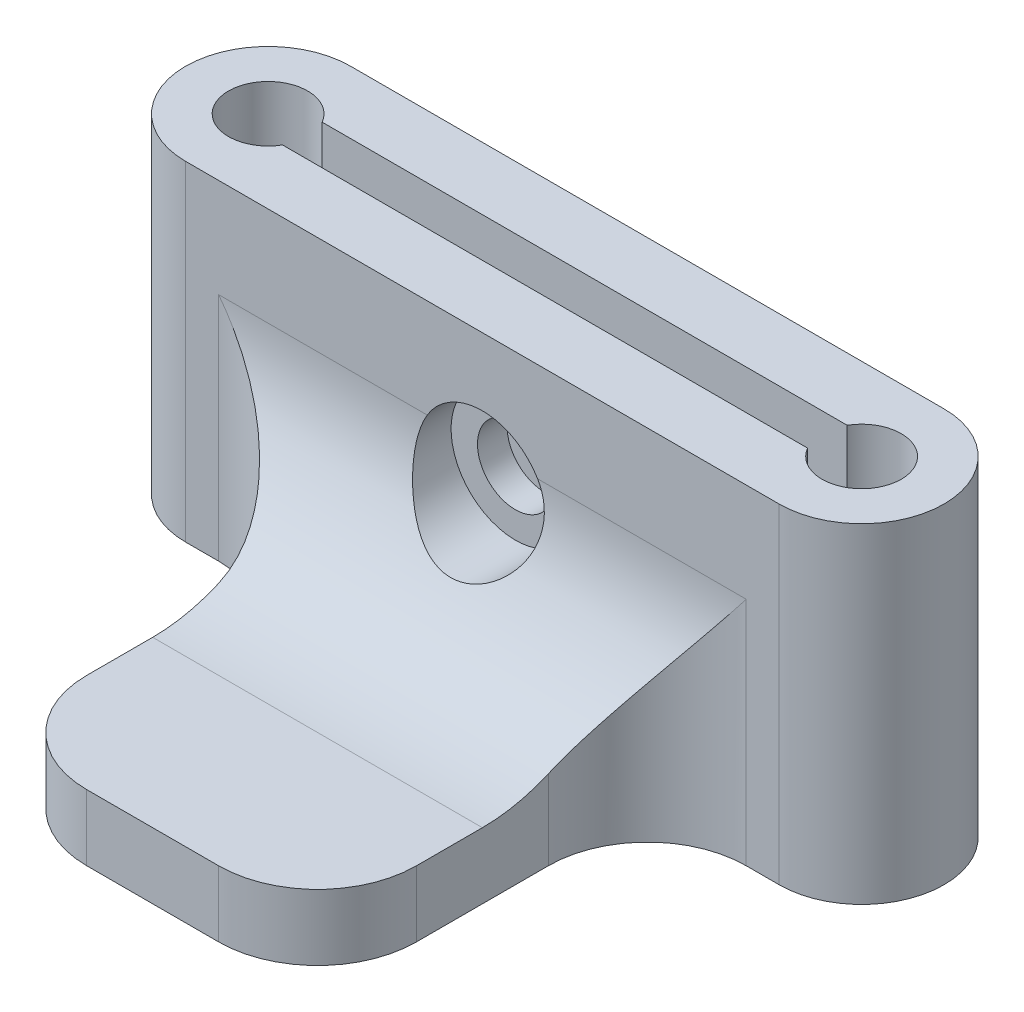
ISO-10303-21;
HEADER;
FILE_DESCRIPTION(('STEP AP214'),'2;1');
FILE_NAME('part.step','',(''),(''),'','','');
FILE_SCHEMA(('AUTOMOTIVE_DESIGN { 1 0 10303 214 1 1 1 1 }'));
ENDSEC;
DATA;
#1=APPLICATION_CONTEXT('core data for automotive mechanical design processes');
#2=APPLICATION_PROTOCOL_DEFINITION('international standard','automotive_design',2000,#1);
#3=PRODUCT_CONTEXT('',#1,'mechanical');
#4=PRODUCT('Part','Part','',(#3));
#5=PRODUCT_RELATED_PRODUCT_CATEGORY('part','',(#4));
#6=PRODUCT_DEFINITION_FORMATION('','',#4);
#7=PRODUCT_DEFINITION_CONTEXT('part definition',#1,'design');
#8=PRODUCT_DEFINITION('design','',#6,#7);
#9=PRODUCT_DEFINITION_SHAPE('','',#8);
#10=(LENGTH_UNIT() NAMED_UNIT(*) SI_UNIT(.MILLI.,.METRE.));
#11=(NAMED_UNIT(*) PLANE_ANGLE_UNIT() SI_UNIT($,.RADIAN.));
#12=(NAMED_UNIT(*) SI_UNIT($,.STERADIAN.) SOLID_ANGLE_UNIT());
#13=UNCERTAINTY_MEASURE_WITH_UNIT(LENGTH_MEASURE(1.E-05),#10,'distance_accuracy_value','');
#14=(GEOMETRIC_REPRESENTATION_CONTEXT(3) GLOBAL_UNCERTAINTY_ASSIGNED_CONTEXT((#13)) GLOBAL_UNIT_ASSIGNED_CONTEXT((#10,
#11,#12)) REPRESENTATION_CONTEXT('',''));
#15=CARTESIAN_POINT('',(0.,0.,0.));
#16=DIRECTION('',(0.,0.,1.));
#17=DIRECTION('',(1.,0.,0.));
#18=AXIS2_PLACEMENT_3D('',#15,#16,#17);
#19=CARTESIAN_POINT('',(0.,6.,-2.5));
#20=DIRECTION('',(0.,0.,1.));
#21=DIRECTION('',(1.,0.,0.));
#22=AXIS2_PLACEMENT_3D('',#19,#20,#21);
#23=CYLINDRICAL_SURFACE('',#22,1.15);
#24=CARTESIAN_POINT('',(0.,6.,-0.6));
#25=DIRECTION('',(0.,0.,-1.));
#26=DIRECTION('',(-1.,0.,0.));
#27=AXIS2_PLACEMENT_3D('',#24,#25,#26);
#28=CIRCLE('',#27,1.15);
#29=CARTESIAN_POINT('',(-1.15,6.,-0.6));
#30=VERTEX_POINT('',#29);
#31=EDGE_CURVE('E329',#30,#30,#28,.T.);
#32=ORIENTED_EDGE('',*,*,#31,.F.);
#33=EDGE_LOOP('',(#32));
#34=FACE_BOUND('',#33,.T.);
#35=CARTESIAN_POINT('',(0.,6.,-1.5));
#36=DIRECTION('',(0.,0.,-1.));
#37=DIRECTION('',(-1.,0.,0.));
#38=AXIS2_PLACEMENT_3D('',#35,#36,#37);
#39=CIRCLE('',#38,1.15);
#40=CARTESIAN_POINT('',(-1.15,6.,-1.5));
#41=VERTEX_POINT('',#40);
#42=EDGE_CURVE('E45',#41,#41,#39,.F.);
#43=ORIENTED_EDGE('',*,*,#42,.F.);
#44=EDGE_LOOP('',(#43));
#45=FACE_BOUND('',#44,.T.);
#46=ADVANCED_FACE('F40',(#34,#45),#23,.F.);
#47=CARTESIAN_POINT('',(0.,7.,7.5));
#48=DIRECTION('',(1.,0.,0.));
#49=DIRECTION('',(0.,0.,-1.));
#50=AXIS2_PLACEMENT_3D('',#47,#48,#49);
#51=CYLINDRICAL_SURFACE('',#50,5.);
#52=CARTESIAN_POINT('',(-1.67406690427832,7.,2.5));
#53=CARTESIAN_POINT('',(-1.70073308535738,6.95537167410613,2.49999521372656));
#54=CARTESIAN_POINT('',(-1.72560393459434,6.90966951600589,2.50059738903919));
#55=CARTESIAN_POINT('',(-1.77160805909839,6.81645570270009,2.50315368422021));
#56=CARTESIAN_POINT('',(-1.7927411796777,6.76894397270334,2.50510786002537));
#57=CARTESIAN_POINT('',(-1.83108568202305,6.6725409855971,2.51050127452824));
#58=CARTESIAN_POINT('',(-1.84830415099491,6.62365240453758,2.51393779631493));
#59=CARTESIAN_POINT('',(-1.87876602827185,6.52480215631494,2.52238465147333));
#60=CARTESIAN_POINT('',(-1.89200965863226,6.47484054926382,2.52739489689658));
#61=CARTESIAN_POINT('',(-1.92568587655717,6.32380490248232,2.54490318245181));
#62=CARTESIAN_POINT('',(-1.94006147560229,6.22158589355841,2.5598784679555));
#63=CARTESIAN_POINT('',(-1.95260783287905,6.01742386276196,2.59639696471644));
#64=CARTESIAN_POINT('',(-1.95078057769003,5.91548080858855,2.61793937048765));
#65=CARTESIAN_POINT('',(-1.93155792898881,5.71377902915791,2.66714469299253));
#66=CARTESIAN_POINT('',(-1.91404454984015,5.61404273859072,2.69485279681775));
#67=CARTESIAN_POINT('',(-1.86439505446577,5.41983399294414,2.75516747675803));
#68=CARTESIAN_POINT('',(-1.83225177503735,5.32536414192284,2.78777644722772));
#69=CARTESIAN_POINT('',(-1.75144744798655,5.13607670458817,2.85922079784568));
#70=CARTESIAN_POINT('',(-1.70165927186262,5.04185087596707,2.89834657650767));
#71=CARTESIAN_POINT('',(-1.58791427236824,4.86322527847743,2.97851806721827));
#72=CARTESIAN_POINT('',(-1.52394626205286,4.77883334855027,3.01956527486444));
#73=CARTESIAN_POINT('',(-1.37638650406848,4.61383635622896,3.10504308222561));
#74=CARTESIAN_POINT('',(-1.29150845583771,4.5343509785695,3.1494250327607));
#75=CARTESIAN_POINT('',(-1.10764526265568,4.39090326468846,3.23390765831196));
#76=CARTESIAN_POINT('',(-1.00867065171909,4.32692943268219,3.27401149146887));
#77=CARTESIAN_POINT('',(-0.819706330259922,4.22812959551905,3.33833165325809));
#78=CARTESIAN_POINT('',(-0.73196945786007,4.19002306987922,3.36412052998636));
#79=CARTESIAN_POINT('',(-0.550115255461745,4.12673666688064,3.40783109348003));
#80=CARTESIAN_POINT('',(-0.456005304824036,4.10154211902466,3.42576170537844));
#81=CARTESIAN_POINT('',(-0.263091665252293,4.06532603071649,3.45176496061463));
#82=CARTESIAN_POINT('',(-0.164262430572092,4.05439358680499,3.45977561755191));
#83=CARTESIAN_POINT('',(0.0341790008173856,4.04777646485801,3.46460664154788));
#84=CARTESIAN_POINT('',(0.133790991407256,4.05208789866325,3.46142986211588));
#85=CARTESIAN_POINT('',(0.3204216112927,4.07444030708378,3.44521880246339));
#86=CARTESIAN_POINT('',(0.407706405130025,4.09107111501183,3.43319779624441));
#87=CARTESIAN_POINT('',(0.577959542607837,4.13554013701498,3.40175582530999));
#88=CARTESIAN_POINT('',(0.660926403235689,4.16338217332143,3.3823323369958));
#89=CARTESIAN_POINT('',(0.826600776505699,4.23144109143092,3.33624266574503));
#90=CARTESIAN_POINT('',(0.90889545738563,4.27237923173694,3.30916923878892));
#91=CARTESIAN_POINT('',(1.06580552368436,4.36450375482435,3.25063076946663));
#92=CARTESIAN_POINT('',(1.14041693269123,4.41569540426173,3.21916347274062));
#93=CARTESIAN_POINT('',(1.29389878556669,4.53727871027522,3.14789608491217));
#94=CARTESIAN_POINT('',(1.37112607376683,4.60946749234836,3.10761462276115));
#95=CARTESIAN_POINT('',(1.51285896192311,4.76515056782671,3.02639180973856));
#96=CARTESIAN_POINT('',(1.5773547179897,4.84865352576855,2.98544997452374));
#97=CARTESIAN_POINT('',(1.69868503659308,5.03529007497091,2.90092350364397));
#98=CARTESIAN_POINT('',(1.75390999095337,5.1395718368558,2.85753962612015));
#99=CARTESIAN_POINT('',(1.84511422711802,5.35808842318574,2.77583791090763));
#100=CARTESIAN_POINT('',(1.88110121719857,5.47231923987139,2.737518048807));
#101=CARTESIAN_POINT('',(1.93053886984989,5.70219223062984,2.66995115518617));
#102=CARTESIAN_POINT('',(1.94495465107492,5.81752491230373,2.6403665337215));
#103=CARTESIAN_POINT('',(1.95282021644864,6.05075147763105,2.58948738352531));
#104=CARTESIAN_POINT('',(1.94627810393311,6.16864435388168,2.56818965425149));
#105=CARTESIAN_POINT('',(1.91343330832309,6.39061030171784,2.53613519536067));
#106=CARTESIAN_POINT('',(1.88919893197711,6.49487381241006,2.52452938213957));
#107=CARTESIAN_POINT('',(1.8237733720463,6.69837252566432,2.50806630861394));
#108=CARTESIAN_POINT('',(1.78261638637919,6.79761741843803,2.50319552399456));
#109=CARTESIAN_POINT('',(1.72429236613589,6.91090020437719,2.50076019776429));
#110=CARTESIAN_POINT('',(1.71463324580583,6.9289532450381,2.5004724635939));
#111=CARTESIAN_POINT('',(1.69476391910178,6.96472333204411,2.50009278544131));
#112=CARTESIAN_POINT('',(1.68455448377905,6.98244080379251,2.50000057446412));
#113=CARTESIAN_POINT('',(1.67406690427832,7.,2.5));
#114=B_SPLINE_CURVE_WITH_KNOTS('',3,(#52,#53,#54,#55,#56,#57,#58,#59,#60,#61,#62,#63,#64,#65,
#66,#67,#68,#69,#70,#71,#72,#73,#74,#75,#76,#77,#78,#79,#80,#81,#82,#83,#84,#85,#86,#87,#88,#89,
#90,#91,#92,#93,#94,#95,#96,#97,#98,#99,#100,#101,#102,#103,#104,#105,#106,#107,#108,#109,#110,
#111,#112,#113),.UNSPECIFIED.,.F.,.F.,(4,2,2,2,2,2,2,2,2,2,2,2,2,2,2,2,2,2,2,2,2,2,2,2,2,2,2,2,
2,2,4),(0.,0.155920196939484,0.311846845205551,0.467488910346208,0.623122278886434,
0.934407686939076,1.24565492982624,1.559263111899,1.87302501064688,2.21220387950027,
2.55165129633048,2.9233170109209,3.29470643204785,3.59072608719665,3.88640865708225,
4.18392967240916,4.48137480641129,4.74919574444659,5.01710806778148,5.30350477462581,
5.59004896648424,5.92807429817455,6.26635997258973,6.64164734353174,7.01678423124045,
7.37457510160791,7.73222764941226,8.05365969932871,8.37444535369733,8.4358712068405,
8.49721312628923),.UNSPECIFIED.);
#115=CARTESIAN_POINT('',(-1.67406690427832,7.,2.5));
#116=VERTEX_POINT('',#115);
#117=CARTESIAN_POINT('',(1.67406690427832,7.,2.5));
#118=VERTEX_POINT('',#117);
#119=EDGE_CURVE('E11',#116,#118,#114,.T.);
#120=ORIENTED_EDGE('',*,*,#119,.F.);
#121=DIRECTION('',(-1.,0.,0.));
#122=VECTOR('',#121,1.);
#123=CARTESIAN_POINT('',(8.,7.,2.5));
#124=LINE('',#123,#122);
#125=CARTESIAN_POINT('',(-8.,7.,2.5));
#126=VERTEX_POINT('',#125);
#127=EDGE_CURVE('E502',#126,#116,#124,.F.);
#128=ORIENTED_EDGE('',*,*,#127,.F.);
#129=CARTESIAN_POINT('',(-5.,2.41742430504416,5.5));
#130=CARTESIAN_POINT('',(-4.99999007584464,2.45619433572678,5.41111111999838));
#131=CARTESIAN_POINT('',(-5.00394885534584,2.49756553159917,5.32342396283325));
#132=CARTESIAN_POINT('',(-5.01909527387803,2.58497092461001,5.15122034191126));
#133=CARTESIAN_POINT('',(-5.0302710810227,2.63099738574335,5.06669892763461));
#134=CARTESIAN_POINT('',(-5.05900041117812,2.72681315065254,4.90214197951033));
#135=CARTESIAN_POINT('',(-5.07648778239047,2.77655933013036,4.82206950990215));
#136=CARTESIAN_POINT('',(-5.11717439439445,2.87977402986982,4.66583225064516));
#137=CARTESIAN_POINT('',(-5.14037657272063,2.93324445430396,4.58966949508105));
#138=CARTESIAN_POINT('',(-5.19855781113315,3.05784842466416,4.42217655542122));
#139=CARTESIAN_POINT('',(-5.23503000053933,3.12994713640746,4.33208183123255));
#140=CARTESIAN_POINT('',(-5.31482188342729,3.27855552023904,4.15875784631887));
#141=CARTESIAN_POINT('',(-5.3581465601076,3.35506837641435,4.07553364946838));
#142=CARTESIAN_POINT('',(-5.45077079658604,3.51210422984339,3.91570229294977));
#143=CARTESIAN_POINT('',(-5.50009596147952,3.59264348248161,3.83912606240481));
#144=CARTESIAN_POINT('',(-5.60362354169447,3.75677463200056,3.69295852675565));
#145=CARTESIAN_POINT('',(-5.65782452771141,3.84036563004705,3.62336518725023));
#146=CARTESIAN_POINT('',(-5.79274014298285,4.04392463557509,3.46462300080977));
#147=CARTESIAN_POINT('',(-5.87542029554436,4.16512727065971,3.37871762693228));
#148=CARTESIAN_POINT('',(-6.04705542389688,4.41143609639691,3.21971495392395));
#149=CARTESIAN_POINT('',(-6.13601288528328,4.53654382227045,3.14662276873676));
#150=CARTESIAN_POINT('',(-6.31881575359726,4.78979065819426,3.01274090730703));
#151=CARTESIAN_POINT('',(-6.41266284424725,4.91793080404366,2.95195550452723));
#152=CARTESIAN_POINT('',(-6.6040431359243,5.17643888357417,2.84228261146679));
#153=CARTESIAN_POINT('',(-6.70157575105506,5.30680646136508,2.79339323916331));
#154=CARTESIAN_POINT('',(-6.99243555246831,5.69263762108821,2.66650236970021));
#155=CARTESIAN_POINT('',(-7.18963215160217,5.9505018544787,2.60433245016192));
#156=CARTESIAN_POINT('',(-7.58839523182633,6.46860044004562,2.52142008987375));
#157=CARTESIAN_POINT('',(-7.7899519738823,6.72882888152428,2.50059336538387));
#158=CARTESIAN_POINT('',(-7.99422653603207,6.99254648939585,2.50000417362007));
#159=CARTESIAN_POINT('',(-7.99711328912772,6.99627327159147,2.50000000728194));
#160=CARTESIAN_POINT('',(-8.,7.,2.5));
#161=B_SPLINE_CURVE_WITH_KNOTS('',3,(#129,#130,#131,#132,#133,#134,#135,#136,#137,#138,#139,
#140,#141,#142,#143,#144,#145,#146,#147,#148,#149,#150,#151,#152,#153,#154,#155,#156,#157,#158,
#159,#160),.UNSPECIFIED.,.F.,.F.,(4,2,2,2,2,2,2,2,2,2,2,2,2,2,2,4),(0.,0.29071592607896,
0.580956446582332,0.868239309782245,1.15567015190112,1.5181890748171,1.88097284765794,
2.24536288350868,2.60964644752272,3.11894232553606,3.62844101097637,4.13811631474608,
4.64771093234505,5.63631090330857,6.6228934001838,6.63703554133181),.UNSPECIFIED.);
#162=CARTESIAN_POINT('',(-5.,2.41742430504416,5.5));
#163=VERTEX_POINT('',#162);
#164=EDGE_CURVE('E510',#163,#126,#161,.T.);
#165=ORIENTED_EDGE('',*,*,#164,.F.);
#166=CARTESIAN_POINT('',(-5.,7.,7.5));
#167=DIRECTION('',(-1.,0.,0.));
#168=DIRECTION('',(0.,0.,1.));
#169=AXIS2_PLACEMENT_3D('',#166,#167,#168);
#170=CIRCLE('',#169,5.);
#171=CARTESIAN_POINT('',(-5.,2.,7.5));
#172=VERTEX_POINT('',#171);
#173=EDGE_CURVE('E506',#172,#163,#170,.F.);
#174=ORIENTED_EDGE('',*,*,#173,.F.);
#175=DIRECTION('',(-1.,0.,0.));
#176=VECTOR('',#175,1.);
#177=CARTESIAN_POINT('',(-8.,2.,7.5));
#178=LINE('',#177,#176);
#179=CARTESIAN_POINT('',(5.,2.,7.5));
#180=VERTEX_POINT('',#179);
#181=EDGE_CURVE('E497',#180,#172,#178,.T.);
#182=ORIENTED_EDGE('',*,*,#181,.F.);
#183=CARTESIAN_POINT('',(5.,7.,7.5));
#184=DIRECTION('',(1.,0.,0.));
#185=DIRECTION('',(0.,0.,-1.));
#186=AXIS2_PLACEMENT_3D('',#183,#184,#185);
#187=CIRCLE('',#186,5.);
#188=CARTESIAN_POINT('',(5.,2.41742430504416,5.5));
#189=VERTEX_POINT('',#188);
#190=EDGE_CURVE('E51',#189,#180,#187,.F.);
#191=ORIENTED_EDGE('',*,*,#190,.F.);
#192=CARTESIAN_POINT('',(5.,2.41742430504416,5.5));
#193=CARTESIAN_POINT('',(4.99999007584464,2.45619433572678,5.41111111999838));
#194=CARTESIAN_POINT('',(5.00394885534584,2.49756553159917,5.32342396283325));
#195=CARTESIAN_POINT('',(5.01909527387803,2.58497092461001,5.15122034191126));
#196=CARTESIAN_POINT('',(5.0302710810227,2.63099738574335,5.06669892763461));
#197=CARTESIAN_POINT('',(5.05900041117813,2.72681315065254,4.90214197951033));
#198=CARTESIAN_POINT('',(5.07648778239047,2.77655933013036,4.82206950990215));
#199=CARTESIAN_POINT('',(5.11717439439445,2.87977402986982,4.66583225064516));
#200=CARTESIAN_POINT('',(5.14037657272063,2.93324445430396,4.58966949508105));
#201=CARTESIAN_POINT('',(5.19855781113315,3.05784842466416,4.42217655542122));
#202=CARTESIAN_POINT('',(5.23503000053933,3.12994713640746,4.33208183123255));
#203=CARTESIAN_POINT('',(5.3148218834273,3.27855552023904,4.15875784631887));
#204=CARTESIAN_POINT('',(5.35814656010761,3.35506837641435,4.07553364946838));
#205=CARTESIAN_POINT('',(5.45077079658604,3.51210422984339,3.91570229294977));
#206=CARTESIAN_POINT('',(5.50009596147952,3.59264348248161,3.83912606240481));
#207=CARTESIAN_POINT('',(5.60362354169447,3.75677463200056,3.69295852675565));
#208=CARTESIAN_POINT('',(5.65782452771141,3.84036563004705,3.62336518725023));
#209=CARTESIAN_POINT('',(5.79274014298285,4.04392463557509,3.46462300080977));
#210=CARTESIAN_POINT('',(5.87542029554436,4.16512727065971,3.37871762693228));
#211=CARTESIAN_POINT('',(6.04705542389688,4.41143609639691,3.21971495392395));
#212=CARTESIAN_POINT('',(6.13601288528329,4.53654382227045,3.14662276873676));
#213=CARTESIAN_POINT('',(6.31881575359726,4.78979065819426,3.01274090730703));
#214=CARTESIAN_POINT('',(6.41266284424726,4.91793080404366,2.95195550452723));
#215=CARTESIAN_POINT('',(6.6040431359243,5.17643888357417,2.84228261146679));
#216=CARTESIAN_POINT('',(6.70157575105506,5.30680646136508,2.79339323916331));
#217=CARTESIAN_POINT('',(6.99243555246832,5.69263762108821,2.66650236970021));
#218=CARTESIAN_POINT('',(7.18963215160217,5.9505018544787,2.60433245016192));
#219=CARTESIAN_POINT('',(7.58839523182633,6.46860044004562,2.52142008987375));
#220=CARTESIAN_POINT('',(7.7899519738823,6.72882888152428,2.50059336538387));
#221=CARTESIAN_POINT('',(7.99422653603207,6.99254648939585,2.50000417362007));
#222=CARTESIAN_POINT('',(7.99711328912772,6.99627327159147,2.50000000728194));
#223=CARTESIAN_POINT('',(8.,7.,2.5));
#224=B_SPLINE_CURVE_WITH_KNOTS('',3,(#192,#193,#194,#195,#196,#197,#198,#199,#200,#201,#202,
#203,#204,#205,#206,#207,#208,#209,#210,#211,#212,#213,#214,#215,#216,#217,#218,#219,#220,#221,
#222,#223),.UNSPECIFIED.,.F.,.F.,(4,2,2,2,2,2,2,2,2,2,2,2,2,2,2,4),(0.,0.29071592607896,
0.580956446582332,0.868239309782245,1.15567015190112,1.5181890748171,1.88097284765794,
2.24536288350868,2.60964644752272,3.11894232553606,3.62844101097637,4.13811631474608,
4.64771093234505,5.63631090330857,6.6228934001838,6.63703554133181),.UNSPECIFIED.);
#225=CARTESIAN_POINT('',(8.,7.,2.5));
#226=VERTEX_POINT('',#225);
#227=EDGE_CURVE('E518',#226,#189,#224,.F.);
#228=ORIENTED_EDGE('',*,*,#227,.F.);
#229=EDGE_CURVE('E501',#118,#226,#124,.F.);
#230=ORIENTED_EDGE('',*,*,#229,.F.);
#231=EDGE_LOOP('',(#120,#128,#165,#174,#182,#191,#228,#230));
#232=FACE_BOUND('',#231,.T.);
#233=ADVANCED_FACE('F42',(#232),#51,.F.);
#234=CARTESIAN_POINT('',(-9.,10.,0.));
#235=DIRECTION('',(0.,1.,0.));
#236=DIRECTION('',(0.,0.,1.));
#237=AXIS2_PLACEMENT_3D('',#234,#235,#236);
#238=PLANE('',#237);
#239=DIRECTION('',(1.,0.,0.));
#240=VECTOR('',#239,1.);
#241=CARTESIAN_POINT('',(-7.96076951545867,10.,-0.6));
#242=LINE('',#241,#240);
#243=CARTESIAN_POINT('',(-7.96076951545867,10.,-0.599999999999996));
#244=VERTEX_POINT('',#243);
#245=CARTESIAN_POINT('',(7.96076951545867,10.,-0.6));
#246=VERTEX_POINT('',#245);
#247=EDGE_CURVE('E345',#244,#246,#242,.T.);
#248=ORIENTED_EDGE('',*,*,#247,.T.);
#249=CARTESIAN_POINT('',(9.,10.,0.));
#250=DIRECTION('',(0.,1.,0.));
#251=DIRECTION('',(0.,0.,1.));
#252=AXIS2_PLACEMENT_3D('',#249,#250,#251);
#253=CIRCLE('',#252,1.2);
#254=CARTESIAN_POINT('',(7.96076951545867,10.,0.6));
#255=VERTEX_POINT('',#254);
#256=EDGE_CURVE('E400',#255,#246,#253,.T.);
#257=ORIENTED_EDGE('',*,*,#256,.F.);
#258=DIRECTION('',(-1.,0.,0.));
#259=VECTOR('',#258,1.);
#260=CARTESIAN_POINT('',(-7.96076951545867,10.,0.6));
#261=LINE('',#260,#259);
#262=CARTESIAN_POINT('',(-7.96076951545867,10.,0.6));
#263=VERTEX_POINT('',#262);
#264=EDGE_CURVE('E341',#255,#263,#261,.T.);
#265=ORIENTED_EDGE('',*,*,#264,.T.);
#266=CARTESIAN_POINT('',(-9.,10.,0.));
#267=DIRECTION('',(0.,1.,0.));
#268=DIRECTION('',(0.,0.,-1.));
#269=AXIS2_PLACEMENT_3D('',#266,#267,#268);
#270=CIRCLE('',#269,1.2);
#271=EDGE_CURVE('E392',#244,#263,#270,.T.);
#272=ORIENTED_EDGE('',*,*,#271,.F.);
#273=EDGE_LOOP('',(#248,#257,#265,#272));
#274=FACE_BOUND('',#273,.T.);
#275=CARTESIAN_POINT('',(-9.,10.,0.));
#276=DIRECTION('',(0.,1.,0.));
#277=DIRECTION('',(0.,0.,1.));
#278=AXIS2_PLACEMENT_3D('',#275,#276,#277);
#279=CIRCLE('',#278,2.5);
#280=CARTESIAN_POINT('',(-9.,10.,-2.5));
#281=VERTEX_POINT('',#280);
#282=CARTESIAN_POINT('',(-9.,10.,2.5));
#283=VERTEX_POINT('',#282);
#284=EDGE_CURVE('E408',#281,#283,#279,.T.);
#285=ORIENTED_EDGE('',*,*,#284,.T.);
#286=DIRECTION('',(1.,0.,0.));
#287=VECTOR('',#286,1.);
#288=CARTESIAN_POINT('',(-9.,10.,2.5));
#289=LINE('',#288,#287);
#290=CARTESIAN_POINT('',(9.,10.,2.5));
#291=VERTEX_POINT('',#290);
#292=EDGE_CURVE('E412',#283,#291,#289,.T.);
#293=ORIENTED_EDGE('',*,*,#292,.T.);
#294=CARTESIAN_POINT('',(9.,10.,0.));
#295=DIRECTION('',(0.,1.,0.));
#296=DIRECTION('',(0.,0.,1.));
#297=AXIS2_PLACEMENT_3D('',#294,#295,#296);
#298=CIRCLE('',#297,2.5);
#299=CARTESIAN_POINT('',(9.,10.,-2.5));
#300=VERTEX_POINT('',#299);
#301=EDGE_CURVE('E416',#291,#300,#298,.T.);
#302=ORIENTED_EDGE('',*,*,#301,.T.);
#303=DIRECTION('',(-1.,0.,0.));
#304=VECTOR('',#303,1.);
#305=CARTESIAN_POINT('',(-9.,10.,-2.5));
#306=LINE('',#305,#304);
#307=EDGE_CURVE('E419',#300,#281,#306,.T.);
#308=ORIENTED_EDGE('',*,*,#307,.T.);
#309=EDGE_LOOP('',(#285,#293,#302,#308));
#310=FACE_BOUND('',#309,.T.);
#311=ADVANCED_FACE('F564',(#274,#310),#238,.T.);
#312=CARTESIAN_POINT('',(-9.,0.,0.));
#313=DIRECTION('',(0.,1.,0.));
#314=DIRECTION('',(0.,0.,1.));
#315=AXIS2_PLACEMENT_3D('',#312,#313,#314);
#316=PLANE('',#315);
#317=DIRECTION('',(-1.,0.,0.));
#318=VECTOR('',#317,1.);
#319=CARTESIAN_POINT('',(-5.,0.,12.5));
#320=LINE('',#319,#318);
#321=CARTESIAN_POINT('',(2.,0.,12.5));
#322=VERTEX_POINT('',#321);
#323=CARTESIAN_POINT('',(-2.,0.,12.5));
#324=VERTEX_POINT('',#323);
#325=EDGE_CURVE('E385',#322,#324,#320,.T.);
#326=ORIENTED_EDGE('',*,*,#325,.T.);
#327=CARTESIAN_POINT('',(-2.,0.,9.5));
#328=DIRECTION('',(0.,1.,0.));
#329=DIRECTION('',(0.,0.,1.));
#330=AXIS2_PLACEMENT_3D('',#327,#328,#329);
#331=CIRCLE('',#330,3.);
#332=CARTESIAN_POINT('',(-5.,0.,9.5));
#333=VERTEX_POINT('',#332);
#334=EDGE_CURVE('E461',#324,#333,#331,.F.);
#335=ORIENTED_EDGE('',*,*,#334,.T.);
#336=DIRECTION('',(0.,0.,-1.));
#337=VECTOR('',#336,1.);
#338=CARTESIAN_POINT('',(-5.,0.,12.5));
#339=LINE('',#338,#337);
#340=CARTESIAN_POINT('',(-5.,0.,5.5));
#341=VERTEX_POINT('',#340);
#342=EDGE_CURVE('E373',#333,#341,#339,.T.);
#343=ORIENTED_EDGE('',*,*,#342,.T.);
#344=CARTESIAN_POINT('',(-8.,0.,5.5));
#345=DIRECTION('',(0.,1.,0.));
#346=DIRECTION('',(0.,0.,1.));
#347=AXIS2_PLACEMENT_3D('',#344,#345,#346);
#348=CIRCLE('',#347,3.);
#349=CARTESIAN_POINT('',(-8.,0.,2.5));
#350=VERTEX_POINT('',#349);
#351=EDGE_CURVE('E494',#341,#350,#348,.T.);
#352=ORIENTED_EDGE('',*,*,#351,.T.);
#353=DIRECTION('',(1.,0.,0.));
#354=VECTOR('',#353,1.);
#355=CARTESIAN_POINT('',(-9.,0.,2.5));
#356=LINE('',#355,#354);
#357=CARTESIAN_POINT('',(-9.,0.,2.5));
#358=VERTEX_POINT('',#357);
#359=EDGE_CURVE('E427',#358,#350,#356,.T.);
#360=ORIENTED_EDGE('',*,*,#359,.F.);
#361=CARTESIAN_POINT('',(-9.,0.,0.));
#362=DIRECTION('',(0.,1.,0.));
#363=DIRECTION('',(0.,0.,1.));
#364=AXIS2_PLACEMENT_3D('',#361,#362,#363);
#365=CIRCLE('',#364,2.5);
#366=CARTESIAN_POINT('',(-9.,0.,-2.5));
#367=VERTEX_POINT('',#366);
#368=EDGE_CURVE('E404',#367,#358,#365,.T.);
#369=ORIENTED_EDGE('',*,*,#368,.F.);
#370=DIRECTION('',(-1.,0.,0.));
#371=VECTOR('',#370,1.);
#372=CARTESIAN_POINT('',(-9.,0.,-2.5));
#373=LINE('',#372,#371);
#374=CARTESIAN_POINT('',(9.,0.,-2.5));
#375=VERTEX_POINT('',#374);
#376=EDGE_CURVE('E413',#375,#367,#373,.T.);
#377=ORIENTED_EDGE('',*,*,#376,.F.);
#378=CARTESIAN_POINT('',(9.,0.,0.));
#379=DIRECTION('',(0.,1.,0.));
#380=DIRECTION('',(0.,0.,1.));
#381=AXIS2_PLACEMENT_3D('',#378,#379,#380);
#382=CIRCLE('',#381,2.5);
#383=CARTESIAN_POINT('',(9.,0.,2.5));
#384=VERTEX_POINT('',#383);
#385=EDGE_CURVE('E431',#384,#375,#382,.T.);
#386=ORIENTED_EDGE('',*,*,#385,.F.);
#387=CARTESIAN_POINT('',(8.,0.,2.5));
#388=VERTEX_POINT('',#387);
#389=EDGE_CURVE('E426',#388,#384,#356,.T.);
#390=ORIENTED_EDGE('',*,*,#389,.F.);
#391=CARTESIAN_POINT('',(8.,0.,5.5));
#392=DIRECTION('',(0.,1.,0.));
#393=DIRECTION('',(0.,0.,1.));
#394=AXIS2_PLACEMENT_3D('',#391,#392,#393);
#395=CIRCLE('',#394,3.);
#396=CARTESIAN_POINT('',(5.,0.,5.5));
#397=VERTEX_POINT('',#396);
#398=EDGE_CURVE('E491',#388,#397,#395,.T.);
#399=ORIENTED_EDGE('',*,*,#398,.T.);
#400=DIRECTION('',(0.,0.,1.));
#401=VECTOR('',#400,1.);
#402=CARTESIAN_POINT('',(5.,0.,12.5));
#403=LINE('',#402,#401);
#404=CARTESIAN_POINT('',(5.,0.,9.5));
#405=VERTEX_POINT('',#404);
#406=EDGE_CURVE('E359',#397,#405,#403,.T.);
#407=ORIENTED_EDGE('',*,*,#406,.T.);
#408=CARTESIAN_POINT('',(2.,0.,9.5));
#409=DIRECTION('',(0.,1.,0.));
#410=DIRECTION('',(0.,0.,1.));
#411=AXIS2_PLACEMENT_3D('',#408,#409,#410);
#412=CIRCLE('',#411,3.);
#413=EDGE_CURVE('E458',#405,#322,#412,.F.);
#414=ORIENTED_EDGE('',*,*,#413,.T.);
#415=EDGE_LOOP('',(#326,#335,#343,#352,#360,#369,#377,#386,#390,#399,#407,#414));
#416=FACE_BOUND('',#415,.T.);
#417=CARTESIAN_POINT('',(9.,0.,0.));
#418=DIRECTION('',(0.,1.,0.));
#419=DIRECTION('',(0.,0.,1.));
#420=AXIS2_PLACEMENT_3D('',#417,#418,#419);
#421=CIRCLE('',#420,1.2);
#422=CARTESIAN_POINT('',(7.96076951545867,0.,0.6));
#423=VERTEX_POINT('',#422);
#424=CARTESIAN_POINT('',(7.96076951545867,0.,-0.6));
#425=VERTEX_POINT('',#424);
#426=EDGE_CURVE('E396',#423,#425,#421,.T.);
#427=ORIENTED_EDGE('',*,*,#426,.T.);
#428=DIRECTION('',(1.,0.,0.));
#429=VECTOR('',#428,1.);
#430=CARTESIAN_POINT('',(-7.96076951545867,0.,-0.6));
#431=LINE('',#430,#429);
#432=CARTESIAN_POINT('',(-7.96076951545867,0.,-0.6));
#433=VERTEX_POINT('',#432);
#434=EDGE_CURVE('E346',#433,#425,#431,.T.);
#435=ORIENTED_EDGE('',*,*,#434,.F.);
#436=CARTESIAN_POINT('',(-9.,0.,0.));
#437=DIRECTION('',(0.,1.,0.));
#438=DIRECTION('',(0.,0.,-1.));
#439=AXIS2_PLACEMENT_3D('',#436,#437,#438);
#440=CIRCLE('',#439,1.2);
#441=CARTESIAN_POINT('',(-7.96076951545867,0.,0.599999999999996));
#442=VERTEX_POINT('',#441);
#443=EDGE_CURVE('E381',#433,#442,#440,.T.);
#444=ORIENTED_EDGE('',*,*,#443,.T.);
#445=DIRECTION('',(-1.,0.,0.));
#446=VECTOR('',#445,1.);
#447=CARTESIAN_POINT('',(-7.96076951545867,0.,0.6));
#448=LINE('',#447,#446);
#449=EDGE_CURVE('E340',#423,#442,#448,.T.);
#450=ORIENTED_EDGE('',*,*,#449,.F.);
#451=EDGE_LOOP('',(#427,#435,#444,#450));
#452=FACE_BOUND('',#451,.T.);
#453=ADVANCED_FACE('F548',(#416,#452),#316,.F.);
#454=CARTESIAN_POINT('',(-9.,10.,0.));
#455=DIRECTION('',(0.,-1.,0.));
#456=DIRECTION('',(0.,0.,-1.));
#457=AXIS2_PLACEMENT_3D('',#454,#455,#456);
#458=CYLINDRICAL_SURFACE('',#457,2.5);
#459=ORIENTED_EDGE('',*,*,#368,.T.);
#460=DIRECTION('',(0.,-1.,0.));
#461=VECTOR('',#460,1.);
#462=CARTESIAN_POINT('',(-9.,10.,2.5));
#463=LINE('',#462,#461);
#464=EDGE_CURVE('E447',#283,#358,#463,.T.);
#465=ORIENTED_EDGE('',*,*,#464,.F.);
#466=ORIENTED_EDGE('',*,*,#284,.F.);
#467=DIRECTION('',(0.,-1.,0.));
#468=VECTOR('',#467,1.);
#469=CARTESIAN_POINT('',(-9.,10.,-2.5));
#470=LINE('',#469,#468);
#471=EDGE_CURVE('E422',#281,#367,#470,.T.);
#472=ORIENTED_EDGE('',*,*,#471,.T.);
#473=EDGE_LOOP('',(#459,#465,#466,#472));
#474=FACE_BOUND('',#473,.T.);
#475=ADVANCED_FACE('F544',(#474),#458,.T.);
#476=CARTESIAN_POINT('',(-9.,10.,2.5));
#477=DIRECTION('',(0.,0.,-1.));
#478=DIRECTION('',(-1.,0.,0.));
#479=AXIS2_PLACEMENT_3D('',#476,#477,#478);
#480=PLANE('',#479);
#481=CARTESIAN_POINT('',(0.,6.,2.5));
#482=DIRECTION('',(0.,0.,-1.));
#483=DIRECTION('',(-1.,0.,0.));
#484=AXIS2_PLACEMENT_3D('',#481,#482,#483);
#485=CIRCLE('',#484,1.95);
#486=EDGE_CURVE('E71',#118,#116,#485,.F.);
#487=ORIENTED_EDGE('',*,*,#486,.F.);
#488=ORIENTED_EDGE('',*,*,#229,.T.);
#489=DIRECTION('',(0.,-1.,0.));
#490=VECTOR('',#489,1.);
#491=CARTESIAN_POINT('',(8.,10.,2.5));
#492=LINE('',#491,#490);
#493=EDGE_CURVE('E487',#226,#388,#492,.T.);
#494=ORIENTED_EDGE('',*,*,#493,.T.);
#495=ORIENTED_EDGE('',*,*,#389,.T.);
#496=DIRECTION('',(0.,-1.,0.));
#497=VECTOR('',#496,1.);
#498=CARTESIAN_POINT('',(9.,10.,2.5));
#499=LINE('',#498,#497);
#500=EDGE_CURVE('E443',#291,#384,#499,.T.);
#501=ORIENTED_EDGE('',*,*,#500,.F.);
#502=ORIENTED_EDGE('',*,*,#292,.F.);
#503=ORIENTED_EDGE('',*,*,#464,.T.);
#504=ORIENTED_EDGE('',*,*,#359,.T.);
#505=DIRECTION('',(0.,1.,0.));
#506=VECTOR('',#505,1.);
#507=CARTESIAN_POINT('',(-8.,10.,2.5));
#508=LINE('',#507,#506);
#509=EDGE_CURVE('E484',#350,#126,#508,.T.);
#510=ORIENTED_EDGE('',*,*,#509,.T.);
#511=ORIENTED_EDGE('',*,*,#127,.T.);
#512=EDGE_LOOP('',(#487,#488,#494,#495,#501,#502,#503,#504,#510,#511));
#513=FACE_BOUND('',#512,.T.);
#514=ADVANCED_FACE('F547',(#513),#480,.F.);
#515=CARTESIAN_POINT('',(9.,10.,0.));
#516=DIRECTION('',(0.,-1.,0.));
#517=DIRECTION('',(0.,0.,-1.));
#518=AXIS2_PLACEMENT_3D('',#515,#516,#517);
#519=CYLINDRICAL_SURFACE('',#518,2.5);
#520=ORIENTED_EDGE('',*,*,#385,.T.);
#521=DIRECTION('',(0.,-1.,0.));
#522=VECTOR('',#521,1.);
#523=CARTESIAN_POINT('',(9.,10.,-2.5));
#524=LINE('',#523,#522);
#525=EDGE_CURVE('E439',#300,#375,#524,.T.);
#526=ORIENTED_EDGE('',*,*,#525,.F.);
#527=ORIENTED_EDGE('',*,*,#301,.F.);
#528=ORIENTED_EDGE('',*,*,#500,.T.);
#529=EDGE_LOOP('',(#520,#526,#527,#528));
#530=FACE_BOUND('',#529,.T.);
#531=ADVANCED_FACE('F552',(#530),#519,.T.);
#532=CARTESIAN_POINT('',(-9.,10.,-2.5));
#533=DIRECTION('',(0.,0.,1.));
#534=DIRECTION('',(1.,0.,0.));
#535=AXIS2_PLACEMENT_3D('',#532,#533,#534);
#536=PLANE('',#535);
#537=DIRECTION('',(0.866025403784438,-0.5,0.));
#538=VECTOR('',#537,1.);
#539=CARTESIAN_POINT('',(0.,8.42487113059643,-2.5));
#540=LINE('',#539,#538);
#541=CARTESIAN_POINT('',(0.,8.42487113059643,-2.5));
#542=VERTEX_POINT('',#541);
#543=CARTESIAN_POINT('',(2.1,7.21243556529821,-2.5));
#544=VERTEX_POINT('',#543);
#545=EDGE_CURVE('E299',#542,#544,#540,.T.);
#546=ORIENTED_EDGE('',*,*,#545,.F.);
#547=DIRECTION('',(0.866025403784439,0.499999999999999,0.));
#548=VECTOR('',#547,1.);
#549=CARTESIAN_POINT('',(-2.1,7.21243556529822,-2.5));
#550=LINE('',#549,#548);
#551=CARTESIAN_POINT('',(-2.1,7.21243556529822,-2.5));
#552=VERTEX_POINT('',#551);
#553=EDGE_CURVE('E62',#552,#542,#550,.T.);
#554=ORIENTED_EDGE('',*,*,#553,.F.);
#555=DIRECTION('',(0.,1.,0.));
#556=VECTOR('',#555,1.);
#557=CARTESIAN_POINT('',(-2.1,4.78756443470179,-2.5));
#558=LINE('',#557,#556);
#559=CARTESIAN_POINT('',(-2.1,4.78756443470179,-2.5));
#560=VERTEX_POINT('',#559);
#561=EDGE_CURVE('E277',#560,#552,#558,.T.);
#562=ORIENTED_EDGE('',*,*,#561,.F.);
#563=DIRECTION('',(-0.866025403784438,0.5,0.));
#564=VECTOR('',#563,1.);
#565=CARTESIAN_POINT('',(0.,3.57512886940357,-2.5));
#566=LINE('',#565,#564);
#567=CARTESIAN_POINT('',(0.,3.57512886940357,-2.5));
#568=VERTEX_POINT('',#567);
#569=EDGE_CURVE('E283',#568,#560,#566,.T.);
#570=ORIENTED_EDGE('',*,*,#569,.F.);
#571=DIRECTION('',(-0.866025403784439,-0.499999999999999,0.));
#572=VECTOR('',#571,1.);
#573=CARTESIAN_POINT('',(2.1,4.78756443470178,-2.5));
#574=LINE('',#573,#572);
#575=CARTESIAN_POINT('',(2.1,4.78756443470178,-2.5));
#576=VERTEX_POINT('',#575);
#577=EDGE_CURVE('E306',#576,#568,#574,.T.);
#578=ORIENTED_EDGE('',*,*,#577,.F.);
#579=DIRECTION('',(0.,-1.,0.));
#580=VECTOR('',#579,1.);
#581=CARTESIAN_POINT('',(2.1,7.21243556529821,-2.5));
#582=LINE('',#581,#580);
#583=EDGE_CURVE('E302',#544,#576,#582,.T.);
#584=ORIENTED_EDGE('',*,*,#583,.F.);
#585=EDGE_LOOP('',(#546,#554,#562,#570,#578,#584));
#586=FACE_BOUND('',#585,.T.);
#587=ORIENTED_EDGE('',*,*,#376,.T.);
#588=ORIENTED_EDGE('',*,*,#471,.F.);
#589=ORIENTED_EDGE('',*,*,#307,.F.);
#590=ORIENTED_EDGE('',*,*,#525,.T.);
#591=EDGE_LOOP('',(#587,#588,#589,#590));
#592=FACE_BOUND('',#591,.T.);
#593=ADVANCED_FACE('F556',(#586,#592),#536,.F.);
#594=CARTESIAN_POINT('',(9.,10.,0.));
#595=DIRECTION('',(0.,-1.,0.));
#596=DIRECTION('',(0.,0.,-1.));
#597=AXIS2_PLACEMENT_3D('',#594,#595,#596);
#598=CYLINDRICAL_SURFACE('',#597,1.2);
#599=DIRECTION('',(0.,-1.,0.));
#600=VECTOR('',#599,1.);
#601=CARTESIAN_POINT('',(7.96076951545867,10.,-0.6));
#602=LINE('',#601,#600);
#603=EDGE_CURVE('E355',#246,#425,#602,.T.);
#604=ORIENTED_EDGE('',*,*,#603,.T.);
#605=ORIENTED_EDGE('',*,*,#426,.F.);
#606=DIRECTION('',(0.,-1.,0.));
#607=VECTOR('',#606,1.);
#608=CARTESIAN_POINT('',(7.96076951545867,10.,0.6));
#609=LINE('',#608,#607);
#610=EDGE_CURVE('E350',#255,#423,#609,.T.);
#611=ORIENTED_EDGE('',*,*,#610,.F.);
#612=ORIENTED_EDGE('',*,*,#256,.T.);
#613=EDGE_LOOP('',(#604,#605,#611,#612));
#614=FACE_BOUND('',#613,.T.);
#615=ADVANCED_FACE('F560',(#614),#598,.F.);
#616=CARTESIAN_POINT('',(-9.,10.,0.));
#617=DIRECTION('',(0.,-1.,0.));
#618=DIRECTION('',(0.,0.,-1.));
#619=AXIS2_PLACEMENT_3D('',#616,#617,#618);
#620=CYLINDRICAL_SURFACE('',#619,1.2);
#621=DIRECTION('',(0.,-1.,0.));
#622=VECTOR('',#621,1.);
#623=CARTESIAN_POINT('',(-7.96076951545867,10.,-0.6));
#624=LINE('',#623,#622);
#625=EDGE_CURVE('E360',#244,#433,#624,.T.);
#626=ORIENTED_EDGE('',*,*,#625,.F.);
#627=ORIENTED_EDGE('',*,*,#271,.T.);
#628=DIRECTION('',(0.,-1.,0.));
#629=VECTOR('',#628,1.);
#630=CARTESIAN_POINT('',(-7.96076951545867,10.,0.6));
#631=LINE('',#630,#629);
#632=EDGE_CURVE('E363',#263,#442,#631,.T.);
#633=ORIENTED_EDGE('',*,*,#632,.T.);
#634=ORIENTED_EDGE('',*,*,#443,.F.);
#635=EDGE_LOOP('',(#626,#627,#633,#634));
#636=FACE_BOUND('',#635,.T.);
#637=ADVANCED_FACE('F571',(#636),#620,.F.);
#638=CARTESIAN_POINT('',(5.,2.,12.5));
#639=DIRECTION('',(1.,0.,0.));
#640=DIRECTION('',(0.,0.,-1.));
#641=AXIS2_PLACEMENT_3D('',#638,#639,#640);
#642=PLANE('',#641);
#643=DIRECTION('',(0.,-1.,0.));
#644=VECTOR('',#643,1.);
#645=CARTESIAN_POINT('',(5.,2.,5.5));
#646=LINE('',#645,#644);
#647=EDGE_CURVE('E477',#397,#189,#646,.F.);
#648=ORIENTED_EDGE('',*,*,#647,.T.);
#649=ORIENTED_EDGE('',*,*,#190,.T.);
#650=DIRECTION('',(0.,0.,1.));
#651=VECTOR('',#650,1.);
#652=CARTESIAN_POINT('',(5.,2.,12.5));
#653=LINE('',#652,#651);
#654=CARTESIAN_POINT('',(5.,2.,9.5));
#655=VERTEX_POINT('',#654);
#656=EDGE_CURVE('E369',#180,#655,#653,.T.);
#657=ORIENTED_EDGE('',*,*,#656,.T.);
#658=DIRECTION('',(0.,-1.,0.));
#659=VECTOR('',#658,1.);
#660=CARTESIAN_POINT('',(5.,2.,9.5));
#661=LINE('',#660,#659);
#662=EDGE_CURVE('E480',#655,#405,#661,.T.);
#663=ORIENTED_EDGE('',*,*,#662,.T.);
#664=ORIENTED_EDGE('',*,*,#406,.F.);
#665=EDGE_LOOP('',(#648,#649,#657,#663,#664));
#666=FACE_BOUND('',#665,.T.);
#667=ADVANCED_FACE('F575',(#666),#642,.T.);
#668=CARTESIAN_POINT('',(-5.,2.,12.5));
#669=DIRECTION('',(-1.,0.,0.));
#670=DIRECTION('',(0.,0.,1.));
#671=AXIS2_PLACEMENT_3D('',#668,#669,#670);
#672=PLANE('',#671);
#673=ORIENTED_EDGE('',*,*,#342,.F.);
#674=DIRECTION('',(0.,-1.,0.));
#675=VECTOR('',#674,1.);
#676=CARTESIAN_POINT('',(-5.,2.,9.5));
#677=LINE('',#676,#675);
#678=CARTESIAN_POINT('',(-5.,2.,9.5));
#679=VERTEX_POINT('',#678);
#680=EDGE_CURVE('E467',#333,#679,#677,.F.);
#681=ORIENTED_EDGE('',*,*,#680,.T.);
#682=DIRECTION('',(0.,0.,-1.));
#683=VECTOR('',#682,1.);
#684=CARTESIAN_POINT('',(-5.,2.,12.5));
#685=LINE('',#684,#683);
#686=EDGE_CURVE('E377',#679,#172,#685,.T.);
#687=ORIENTED_EDGE('',*,*,#686,.T.);
#688=ORIENTED_EDGE('',*,*,#173,.T.);
#689=DIRECTION('',(0.,1.,0.));
#690=VECTOR('',#689,1.);
#691=CARTESIAN_POINT('',(-5.,2.,5.5));
#692=LINE('',#691,#690);
#693=EDGE_CURVE('E464',#163,#341,#692,.F.);
#694=ORIENTED_EDGE('',*,*,#693,.T.);
#695=EDGE_LOOP('',(#673,#681,#687,#688,#694));
#696=FACE_BOUND('',#695,.T.);
#697=ADVANCED_FACE('F579',(#696),#672,.T.);
#698=CARTESIAN_POINT('',(0.,2.,0.));
#699=DIRECTION('',(0.,-1.,0.));
#700=DIRECTION('',(0.,0.,-1.));
#701=AXIS2_PLACEMENT_3D('',#698,#699,#700);
#702=PLANE('',#701);
#703=ORIENTED_EDGE('',*,*,#656,.F.);
#704=ORIENTED_EDGE('',*,*,#181,.T.);
#705=ORIENTED_EDGE('',*,*,#686,.F.);
#706=CARTESIAN_POINT('',(-2.,2.,9.5));
#707=DIRECTION('',(0.,-1.,0.));
#708=DIRECTION('',(0.,0.,-1.));
#709=AXIS2_PLACEMENT_3D('',#706,#707,#708);
#710=CIRCLE('',#709,3.);
#711=CARTESIAN_POINT('',(-2.,2.,12.5));
#712=VERTEX_POINT('',#711);
#713=EDGE_CURVE('E474',#679,#712,#710,.F.);
#714=ORIENTED_EDGE('',*,*,#713,.T.);
#715=DIRECTION('',(-1.,0.,0.));
#716=VECTOR('',#715,1.);
#717=CARTESIAN_POINT('',(-5.,2.,12.5));
#718=LINE('',#717,#716);
#719=CARTESIAN_POINT('',(2.,2.,12.5));
#720=VERTEX_POINT('',#719);
#721=EDGE_CURVE('E372',#720,#712,#718,.T.);
#722=ORIENTED_EDGE('',*,*,#721,.F.);
#723=CARTESIAN_POINT('',(2.,2.,9.5));
#724=DIRECTION('',(0.,-1.,0.));
#725=DIRECTION('',(0.,0.,-1.));
#726=AXIS2_PLACEMENT_3D('',#723,#724,#725);
#727=CIRCLE('',#726,3.);
#728=EDGE_CURVE('E470',#720,#655,#727,.F.);
#729=ORIENTED_EDGE('',*,*,#728,.T.);
#730=EDGE_LOOP('',(#703,#704,#705,#714,#722,#729));
#731=FACE_BOUND('',#730,.T.);
#732=ADVANCED_FACE('F583',(#731),#702,.F.);
#733=CARTESIAN_POINT('',(-5.,2.,12.5));
#734=DIRECTION('',(0.,0.,1.));
#735=DIRECTION('',(1.,0.,0.));
#736=AXIS2_PLACEMENT_3D('',#733,#734,#735);
#737=PLANE('',#736);
#738=ORIENTED_EDGE('',*,*,#721,.T.);
#739=DIRECTION('',(0.,-1.,0.));
#740=VECTOR('',#739,1.);
#741=CARTESIAN_POINT('',(-2.,2.,12.5));
#742=LINE('',#741,#740);
#743=EDGE_CURVE('E454',#712,#324,#742,.T.);
#744=ORIENTED_EDGE('',*,*,#743,.T.);
#745=ORIENTED_EDGE('',*,*,#325,.F.);
#746=DIRECTION('',(0.,-1.,0.));
#747=VECTOR('',#746,1.);
#748=CARTESIAN_POINT('',(2.,2.,12.5));
#749=LINE('',#748,#747);
#750=EDGE_CURVE('E451',#322,#720,#749,.F.);
#751=ORIENTED_EDGE('',*,*,#750,.T.);
#752=EDGE_LOOP('',(#738,#744,#745,#751));
#753=FACE_BOUND('',#752,.T.);
#754=ADVANCED_FACE('F542',(#753),#737,.T.);
#755=CARTESIAN_POINT('',(-2.,2.,9.5));
#756=DIRECTION('',(0.,-1.,0.));
#757=DIRECTION('',(0.,0.,-1.));
#758=AXIS2_PLACEMENT_3D('',#755,#756,#757);
#759=CYLINDRICAL_SURFACE('',#758,3.);
#760=ORIENTED_EDGE('',*,*,#713,.F.);
#761=ORIENTED_EDGE('',*,*,#680,.F.);
#762=ORIENTED_EDGE('',*,*,#334,.F.);
#763=ORIENTED_EDGE('',*,*,#743,.F.);
#764=EDGE_LOOP('',(#760,#761,#762,#763));
#765=FACE_BOUND('',#764,.T.);
#766=ADVANCED_FACE('F538',(#765),#759,.T.);
#767=CARTESIAN_POINT('',(2.,2.,9.5));
#768=DIRECTION('',(0.,-1.,0.));
#769=DIRECTION('',(0.,0.,-1.));
#770=AXIS2_PLACEMENT_3D('',#767,#768,#769);
#771=CYLINDRICAL_SURFACE('',#770,3.);
#772=ORIENTED_EDGE('',*,*,#728,.F.);
#773=ORIENTED_EDGE('',*,*,#750,.F.);
#774=ORIENTED_EDGE('',*,*,#413,.F.);
#775=ORIENTED_EDGE('',*,*,#662,.F.);
#776=EDGE_LOOP('',(#772,#773,#774,#775));
#777=FACE_BOUND('',#776,.T.);
#778=ADVANCED_FACE('F534',(#777),#771,.T.);
#779=CARTESIAN_POINT('',(8.,10.,5.5));
#780=DIRECTION('',(0.,-1.,0.));
#781=DIRECTION('',(0.,0.,-1.));
#782=AXIS2_PLACEMENT_3D('',#779,#780,#781);
#783=CYLINDRICAL_SURFACE('',#782,3.);
#784=ORIENTED_EDGE('',*,*,#493,.F.);
#785=ORIENTED_EDGE('',*,*,#227,.T.);
#786=ORIENTED_EDGE('',*,*,#647,.F.);
#787=ORIENTED_EDGE('',*,*,#398,.F.);
#788=EDGE_LOOP('',(#784,#785,#786,#787));
#789=FACE_BOUND('',#788,.T.);
#790=ADVANCED_FACE('F529',(#789),#783,.F.);
#791=CARTESIAN_POINT('',(-8.,10.,5.5));
#792=DIRECTION('',(0.,1.,0.));
#793=DIRECTION('',(0.,0.,1.));
#794=AXIS2_PLACEMENT_3D('',#791,#792,#793);
#795=CYLINDRICAL_SURFACE('',#794,3.);
#796=ORIENTED_EDGE('',*,*,#351,.F.);
#797=ORIENTED_EDGE('',*,*,#693,.F.);
#798=ORIENTED_EDGE('',*,*,#164,.T.);
#799=ORIENTED_EDGE('',*,*,#509,.F.);
#800=EDGE_LOOP('',(#796,#797,#798,#799));
#801=FACE_BOUND('',#800,.T.);
#802=ADVANCED_FACE('F525',(#801),#795,.F.);
#803=CARTESIAN_POINT('',(-7.96076951545867,10.,0.6));
#804=DIRECTION('',(0.,0.,1.));
#805=DIRECTION('',(1.,0.,0.));
#806=AXIS2_PLACEMENT_3D('',#803,#804,#805);
#807=PLANE('',#806);
#808=CARTESIAN_POINT('',(0.,6.,0.6));
#809=DIRECTION('',(0.,0.,1.));
#810=DIRECTION('',(1.,0.,0.));
#811=AXIS2_PLACEMENT_3D('',#808,#809,#810);
#812=CIRCLE('',#811,1.15);
#813=CARTESIAN_POINT('',(1.15,6.,0.6));
#814=VERTEX_POINT('',#813);
#815=EDGE_CURVE('E330',#814,#814,#812,.T.);
#816=ORIENTED_EDGE('',*,*,#815,.T.);
#817=EDGE_LOOP('',(#816));
#818=FACE_BOUND('',#817,.T.);
#819=ORIENTED_EDGE('',*,*,#449,.T.);
#820=ORIENTED_EDGE('',*,*,#632,.F.);
#821=ORIENTED_EDGE('',*,*,#264,.F.);
#822=ORIENTED_EDGE('',*,*,#610,.T.);
#823=EDGE_LOOP('',(#819,#820,#821,#822));
#824=FACE_BOUND('',#823,.T.);
#825=ADVANCED_FACE('F528',(#818,#824),#807,.F.);
#826=CARTESIAN_POINT('',(-7.96076951545867,10.,-0.6));
#827=DIRECTION('',(0.,0.,-1.));
#828=DIRECTION('',(-1.,0.,0.));
#829=AXIS2_PLACEMENT_3D('',#826,#827,#828);
#830=PLANE('',#829);
#831=ORIENTED_EDGE('',*,*,#31,.T.);
#832=EDGE_LOOP('',(#831));
#833=FACE_BOUND('',#832,.T.);
#834=ORIENTED_EDGE('',*,*,#434,.T.);
#835=ORIENTED_EDGE('',*,*,#603,.F.);
#836=ORIENTED_EDGE('',*,*,#247,.F.);
#837=ORIENTED_EDGE('',*,*,#625,.T.);
#838=EDGE_LOOP('',(#834,#835,#836,#837));
#839=FACE_BOUND('',#838,.T.);
#840=ADVANCED_FACE('F593',(#833,#839),#830,.F.);
#841=CARTESIAN_POINT('',(0.,6.,12.5));
#842=DIRECTION('',(0.,0.,-1.));
#843=DIRECTION('',(-1.,0.,0.));
#844=AXIS2_PLACEMENT_3D('',#841,#842,#843);
#845=CYLINDRICAL_SURFACE('',#844,1.95);
#846=CARTESIAN_POINT('',(0.,6.,1.5));
#847=DIRECTION('',(0.,0.,1.));
#848=DIRECTION('',(1.,0.,0.));
#849=AXIS2_PLACEMENT_3D('',#846,#847,#848);
#850=CIRCLE('',#849,1.95);
#851=CARTESIAN_POINT('',(1.95,6.,1.5));
#852=VERTEX_POINT('',#851);
#853=EDGE_CURVE('E334',#852,#852,#850,.T.);
#854=ORIENTED_EDGE('',*,*,#853,.F.);
#855=EDGE_LOOP('',(#854));
#856=FACE_BOUND('',#855,.T.);
#857=ORIENTED_EDGE('',*,*,#486,.T.);
#858=ORIENTED_EDGE('',*,*,#119,.T.);
#859=EDGE_LOOP('',(#857,#858));
#860=FACE_BOUND('',#859,.T.);
#861=ADVANCED_FACE('F597',(#856,#860),#845,.F.);
#862=CARTESIAN_POINT('',(0.,6.,1.5));
#863=DIRECTION('',(0.,0.,1.));
#864=DIRECTION('',(1.,0.,0.));
#865=AXIS2_PLACEMENT_3D('',#862,#863,#864);
#866=PLANE('',#865);
#867=CARTESIAN_POINT('',(0.,6.,1.5));
#868=DIRECTION('',(0.,0.,1.));
#869=DIRECTION('',(1.,0.,0.));
#870=AXIS2_PLACEMENT_3D('',#867,#868,#869);
#871=CIRCLE('',#870,1.15);
#872=CARTESIAN_POINT('',(1.15,6.,1.5));
#873=VERTEX_POINT('',#872);
#874=EDGE_CURVE('E325',#873,#873,#871,.T.);
#875=ORIENTED_EDGE('',*,*,#874,.F.);
#876=EDGE_LOOP('',(#875));
#877=FACE_BOUND('',#876,.T.);
#878=ORIENTED_EDGE('',*,*,#853,.T.);
#879=EDGE_LOOP('',(#878));
#880=FACE_BOUND('',#879,.T.);
#881=ADVANCED_FACE('F602',(#877,#880),#866,.T.);
#882=ORIENTED_EDGE('',*,*,#874,.T.);
#883=EDGE_LOOP('',(#882));
#884=FACE_BOUND('',#883,.T.);
#885=ORIENTED_EDGE('',*,*,#815,.F.);
#886=EDGE_LOOP('',(#885));
#887=FACE_BOUND('',#886,.T.);
#888=ADVANCED_FACE('F616',(#884,#887),#23,.F.);
#889=CARTESIAN_POINT('',(0.,0.,-1.5));
#890=DIRECTION('',(0.,0.,-1.));
#891=DIRECTION('',(-1.,0.,0.));
#892=AXIS2_PLACEMENT_3D('',#889,#890,#891);
#893=PLANE('',#892);
#894=DIRECTION('',(0.866025403784439,0.499999999999999,0.));
#895=VECTOR('',#894,1.);
#896=CARTESIAN_POINT('',(-2.1,7.21243556529822,-1.5));
#897=LINE('',#896,#895);
#898=CARTESIAN_POINT('',(-2.1,7.21243556529822,-1.5));
#899=VERTEX_POINT('',#898);
#900=CARTESIAN_POINT('',(0.,8.42487113059643,-1.5));
#901=VERTEX_POINT('',#900);
#902=EDGE_CURVE('E254',#899,#901,#897,.T.);
#903=ORIENTED_EDGE('',*,*,#902,.T.);
#904=DIRECTION('',(0.866025403784438,-0.5,0.));
#905=VECTOR('',#904,1.);
#906=CARTESIAN_POINT('',(0.,8.42487113059643,-1.5));
#907=LINE('',#906,#905);
#908=CARTESIAN_POINT('',(2.1,7.21243556529821,-1.5));
#909=VERTEX_POINT('',#908);
#910=EDGE_CURVE('E264',#901,#909,#907,.T.);
#911=ORIENTED_EDGE('',*,*,#910,.T.);
#912=DIRECTION('',(0.,-1.,0.));
#913=VECTOR('',#912,1.);
#914=CARTESIAN_POINT('',(2.1,7.21243556529821,-1.5));
#915=LINE('',#914,#913);
#916=CARTESIAN_POINT('',(2.1,4.78756443470178,-1.5));
#917=VERTEX_POINT('',#916);
#918=EDGE_CURVE('E270',#909,#917,#915,.T.);
#919=ORIENTED_EDGE('',*,*,#918,.T.);
#920=DIRECTION('',(-0.866025403784439,-0.499999999999999,0.));
#921=VECTOR('',#920,1.);
#922=CARTESIAN_POINT('',(2.1,4.78756443470178,-1.5));
#923=LINE('',#922,#921);
#924=CARTESIAN_POINT('',(0.,3.57512886940357,-1.5));
#925=VERTEX_POINT('',#924);
#926=EDGE_CURVE('E288',#917,#925,#923,.T.);
#927=ORIENTED_EDGE('',*,*,#926,.T.);
#928=DIRECTION('',(-0.866025403784438,0.5,0.));
#929=VECTOR('',#928,1.);
#930=CARTESIAN_POINT('',(0.,3.57512886940357,-1.5));
#931=LINE('',#930,#929);
#932=CARTESIAN_POINT('',(-2.1,4.78756443470179,-1.5));
#933=VERTEX_POINT('',#932);
#934=EDGE_CURVE('E292',#925,#933,#931,.T.);
#935=ORIENTED_EDGE('',*,*,#934,.T.);
#936=DIRECTION('',(0.,1.,0.));
#937=VECTOR('',#936,1.);
#938=CARTESIAN_POINT('',(-2.1,4.78756443470179,-1.5));
#939=LINE('',#938,#937);
#940=EDGE_CURVE('E261',#933,#899,#939,.T.);
#941=ORIENTED_EDGE('',*,*,#940,.T.);
#942=EDGE_LOOP('',(#903,#911,#919,#927,#935,#941));
#943=FACE_BOUND('',#942,.T.);
#944=ORIENTED_EDGE('',*,*,#42,.T.);
#945=EDGE_LOOP('',(#944));
#946=FACE_BOUND('',#945,.T.);
#947=ADVANCED_FACE('F272',(#943,#946),#893,.T.);
#948=CARTESIAN_POINT('',(-2.1,7.21243556529822,-1.5));
#949=DIRECTION('',(-0.499999999999999,0.866025403784439,0.));
#950=DIRECTION('',(-0.866025403784439,-0.499999999999999,0.));
#951=AXIS2_PLACEMENT_3D('',#948,#949,#950);
#952=PLANE('',#951);
#953=ORIENTED_EDGE('',*,*,#553,.T.);
#954=DIRECTION('',(0.,0.,-1.));
#955=VECTOR('',#954,1.);
#956=CARTESIAN_POINT('',(0.,8.42487113059643,-1.5));
#957=LINE('',#956,#955);
#958=EDGE_CURVE('E250',#901,#542,#957,.T.);
#959=ORIENTED_EDGE('',*,*,#958,.F.);
#960=ORIENTED_EDGE('',*,*,#902,.F.);
#961=DIRECTION('',(0.,0.,-1.));
#962=VECTOR('',#961,1.);
#963=CARTESIAN_POINT('',(-2.1,7.21243556529822,-1.5));
#964=LINE('',#963,#962);
#965=EDGE_CURVE('E313',#899,#552,#964,.T.);
#966=ORIENTED_EDGE('',*,*,#965,.T.);
#967=EDGE_LOOP('',(#953,#959,#960,#966));
#968=FACE_BOUND('',#967,.T.);
#969=ADVANCED_FACE('F252',(#968),#952,.F.);
#970=CARTESIAN_POINT('',(-2.1,4.78756443470179,-1.5));
#971=DIRECTION('',(-1.,0.,0.));
#972=DIRECTION('',(0.,-1.,0.));
#973=AXIS2_PLACEMENT_3D('',#970,#971,#972);
#974=PLANE('',#973);
#975=ORIENTED_EDGE('',*,*,#561,.T.);
#976=ORIENTED_EDGE('',*,*,#965,.F.);
#977=ORIENTED_EDGE('',*,*,#940,.F.);
#978=DIRECTION('',(0.,0.,-1.));
#979=VECTOR('',#978,1.);
#980=CARTESIAN_POINT('',(-2.1,4.78756443470179,-1.5));
#981=LINE('',#980,#979);
#982=EDGE_CURVE('E315',#933,#560,#981,.T.);
#983=ORIENTED_EDGE('',*,*,#982,.T.);
#984=EDGE_LOOP('',(#975,#976,#977,#983));
#985=FACE_BOUND('',#984,.T.);
#986=ADVANCED_FACE('F784',(#985),#974,.F.);
#987=CARTESIAN_POINT('',(0.,3.57512886940357,-1.5));
#988=DIRECTION('',(-0.5,-0.866025403784439,0.));
#989=DIRECTION('',(0.866025403784438,-0.5,0.));
#990=AXIS2_PLACEMENT_3D('',#987,#988,#989);
#991=PLANE('',#990);
#992=ORIENTED_EDGE('',*,*,#569,.T.);
#993=ORIENTED_EDGE('',*,*,#982,.F.);
#994=ORIENTED_EDGE('',*,*,#934,.F.);
#995=DIRECTION('',(0.,0.,-1.));
#996=VECTOR('',#995,1.);
#997=CARTESIAN_POINT('',(0.,3.57512886940357,-1.5));
#998=LINE('',#997,#996);
#999=EDGE_CURVE('E317',#925,#568,#998,.T.);
#1000=ORIENTED_EDGE('',*,*,#999,.T.);
#1001=EDGE_LOOP('',(#992,#993,#994,#1000));
#1002=FACE_BOUND('',#1001,.T.);
#1003=ADVANCED_FACE('F791',(#1002),#991,.F.);
#1004=CARTESIAN_POINT('',(2.1,4.78756443470178,-1.5));
#1005=DIRECTION('',(0.499999999999999,-0.866025403784439,0.));
#1006=DIRECTION('',(0.866025403784439,0.499999999999999,0.));
#1007=AXIS2_PLACEMENT_3D('',#1004,#1005,#1006);
#1008=PLANE('',#1007);
#1009=ORIENTED_EDGE('',*,*,#577,.T.);
#1010=ORIENTED_EDGE('',*,*,#999,.F.);
#1011=ORIENTED_EDGE('',*,*,#926,.F.);
#1012=DIRECTION('',(0.,0.,-1.));
#1013=VECTOR('',#1012,1.);
#1014=CARTESIAN_POINT('',(2.1,4.78756443470178,-1.5));
#1015=LINE('',#1014,#1013);
#1016=EDGE_CURVE('E320',#917,#576,#1015,.T.);
#1017=ORIENTED_EDGE('',*,*,#1016,.T.);
#1018=EDGE_LOOP('',(#1009,#1010,#1011,#1017));
#1019=FACE_BOUND('',#1018,.T.);
#1020=ADVANCED_FACE('F799',(#1019),#1008,.F.);
#1021=CARTESIAN_POINT('',(2.1,7.21243556529821,-1.5));
#1022=DIRECTION('',(1.,0.,0.));
#1023=DIRECTION('',(0.,1.,0.));
#1024=AXIS2_PLACEMENT_3D('',#1021,#1022,#1023);
#1025=PLANE('',#1024);
#1026=ORIENTED_EDGE('',*,*,#583,.T.);
#1027=ORIENTED_EDGE('',*,*,#1016,.F.);
#1028=ORIENTED_EDGE('',*,*,#918,.F.);
#1029=DIRECTION('',(0.,0.,-1.));
#1030=VECTOR('',#1029,1.);
#1031=CARTESIAN_POINT('',(2.1,7.21243556529821,-1.5));
#1032=LINE('',#1031,#1030);
#1033=EDGE_CURVE('E260',#909,#544,#1032,.T.);
#1034=ORIENTED_EDGE('',*,*,#1033,.T.);
#1035=EDGE_LOOP('',(#1026,#1027,#1028,#1034));
#1036=FACE_BOUND('',#1035,.T.);
#1037=ADVANCED_FACE('F807',(#1036),#1025,.F.);
#1038=CARTESIAN_POINT('',(0.,8.42487113059643,-1.5));
#1039=DIRECTION('',(0.5,0.866025403784439,0.));
#1040=DIRECTION('',(-0.866025403784438,0.5,0.));
#1041=AXIS2_PLACEMENT_3D('',#1038,#1039,#1040);
#1042=PLANE('',#1041);
#1043=ORIENTED_EDGE('',*,*,#545,.T.);
#1044=ORIENTED_EDGE('',*,*,#1033,.F.);
#1045=ORIENTED_EDGE('',*,*,#910,.F.);
#1046=ORIENTED_EDGE('',*,*,#958,.T.);
#1047=EDGE_LOOP('',(#1043,#1044,#1045,#1046));
#1048=FACE_BOUND('',#1047,.T.);
#1049=ADVANCED_FACE('F265',(#1048),#1042,.F.);
#1050=CLOSED_SHELL('',(#46,#233,#311,#453,#475,#514,#531,#593,#615,#637,#667,#697,#732,#754,
#766,#778,#790,#802,#825,#840,#861,#881,#888,#947,#969,#986,#1003,#1020,#1037,#1049));
#1051=MANIFOLD_SOLID_BREP('B2',#1050);
#1052=ADVANCED_BREP_SHAPE_REPRESENTATION('',(#18,#1051),#14);
#1053=SHAPE_DEFINITION_REPRESENTATION(#9,#1052);
ENDSEC;
END-ISO-10303-21;
